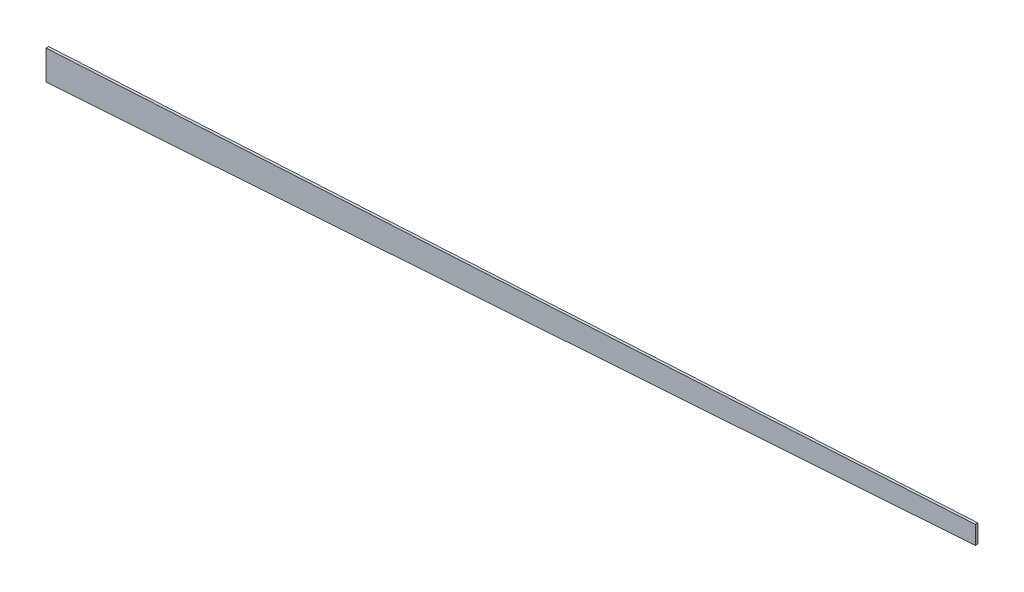
ISO-10303-21;
HEADER;
FILE_DESCRIPTION(('STEP AP214'),'2;1');
FILE_NAME('part.step','',(''),(''),'','','');
FILE_SCHEMA(('AUTOMOTIVE_DESIGN { 1 0 10303 214 1 1 1 1 }'));
ENDSEC;
DATA;
#1=APPLICATION_CONTEXT('core data for automotive mechanical design processes');
#2=APPLICATION_PROTOCOL_DEFINITION('international standard','automotive_design',2000,#1);
#3=PRODUCT_CONTEXT('',#1,'mechanical');
#4=PRODUCT('Part','Part','',(#3));
#5=PRODUCT_RELATED_PRODUCT_CATEGORY('part','',(#4));
#6=PRODUCT_DEFINITION_FORMATION('','',#4);
#7=PRODUCT_DEFINITION_CONTEXT('part definition',#1,'design');
#8=PRODUCT_DEFINITION('design','',#6,#7);
#9=PRODUCT_DEFINITION_SHAPE('','',#8);
#10=(LENGTH_UNIT() NAMED_UNIT(*) SI_UNIT(.MILLI.,.METRE.));
#11=(NAMED_UNIT(*) PLANE_ANGLE_UNIT() SI_UNIT($,.RADIAN.));
#12=(NAMED_UNIT(*) SI_UNIT($,.STERADIAN.) SOLID_ANGLE_UNIT());
#13=UNCERTAINTY_MEASURE_WITH_UNIT(LENGTH_MEASURE(1.E-05),#10,'distance_accuracy_value','');
#14=(GEOMETRIC_REPRESENTATION_CONTEXT(3) GLOBAL_UNCERTAINTY_ASSIGNED_CONTEXT((#13)) GLOBAL_UNIT_ASSIGNED_CONTEXT((#10,
#11,#12)) REPRESENTATION_CONTEXT('',''));
#15=CARTESIAN_POINT('',(0.,0.,0.));
#16=DIRECTION('',(0.,0.,1.));
#17=DIRECTION('',(1.,0.,0.));
#18=AXIS2_PLACEMENT_3D('',#15,#16,#17);
#19=CARTESIAN_POINT('',(-1000.,0.,0.));
#20=DIRECTION('',(1.,0.,0.));
#21=DIRECTION('',(0.,0.,-1.));
#22=AXIS2_PLACEMENT_3D('',#19,#20,#21);
#23=PLANE('',#22);
#24=DIRECTION('',(0.,-1.,0.));
#25=VECTOR('',#24,1.);
#26=CARTESIAN_POINT('',(-1000.,0.,179.5));
#27=LINE('',#26,#25);
#28=CARTESIAN_POINT('',(-1000.,26.,179.5));
#29=VERTEX_POINT('',#28);
#30=CARTESIAN_POINT('',(-1000.,0.,179.5));
#31=VERTEX_POINT('',#30);
#32=EDGE_CURVE('E270',#29,#31,#27,.T.);
#33=ORIENTED_EDGE('',*,*,#32,.F.);
#34=DIRECTION('',(0.,0.,1.));
#35=VECTOR('',#34,1.);
#36=CARTESIAN_POINT('',(-1000.,26.,176.5));
#37=LINE('',#36,#35);
#38=CARTESIAN_POINT('',(-1000.,26.,176.5));
#39=VERTEX_POINT('',#38);
#40=EDGE_CURVE('E262',#39,#29,#37,.T.);
#41=ORIENTED_EDGE('',*,*,#40,.F.);
#42=DIRECTION('',(0.,1.,0.));
#43=VECTOR('',#42,1.);
#44=CARTESIAN_POINT('',(-1000.,-8.,176.5));
#45=LINE('',#44,#43);
#46=CARTESIAN_POINT('',(-1000.,-8.,176.5));
#47=VERTEX_POINT('',#46);
#48=EDGE_CURVE('E256',#47,#39,#45,.T.);
#49=ORIENTED_EDGE('',*,*,#48,.F.);
#50=DIRECTION('',(0.,0.,-1.));
#51=VECTOR('',#50,1.);
#52=CARTESIAN_POINT('',(-1000.,-8.,179.5));
#53=LINE('',#52,#51);
#54=CARTESIAN_POINT('',(-1000.,-8.,179.5));
#55=VERTEX_POINT('',#54);
#56=EDGE_CURVE('E96',#55,#47,#53,.T.);
#57=ORIENTED_EDGE('',*,*,#56,.F.);
#58=DIRECTION('',(0.,-1.,0.));
#59=VECTOR('',#58,1.);
#60=CARTESIAN_POINT('',(-1000.,0.,179.5));
#61=LINE('',#60,#59);
#62=EDGE_CURVE('E12',#31,#55,#61,.T.);
#63=ORIENTED_EDGE('',*,*,#62,.F.);
#64=EDGE_LOOP('',(#33,#41,#49,#57,#63));
#65=FACE_BOUND('',#64,.T.);
#66=ADVANCED_FACE('F86',(#65),#23,.F.);
#67=CARTESIAN_POINT('',(0.,0.,0.));
#68=DIRECTION('',(-1.,0.,0.));
#69=DIRECTION('',(0.,0.,1.));
#70=AXIS2_PLACEMENT_3D('',#67,#68,#69);
#71=PLANE('',#70);
#72=DIRECTION('',(0.,1.,0.));
#73=VECTOR('',#72,1.);
#74=CARTESIAN_POINT('',(0.,16.,106.5));
#75=LINE('',#74,#73);
#76=CARTESIAN_POINT('',(0.,-5.,106.5));
#77=VERTEX_POINT('',#76);
#78=CARTESIAN_POINT('',(0.,16.,106.5));
#79=VERTEX_POINT('',#78);
#80=EDGE_CURVE('E137',#77,#79,#75,.T.);
#81=ORIENTED_EDGE('',*,*,#80,.T.);
#82=DIRECTION('',(0.,0.,1.));
#83=VECTOR('',#82,1.);
#84=CARTESIAN_POINT('',(0.,16.,109.5));
#85=LINE('',#84,#83);
#86=CARTESIAN_POINT('',(0.,16.,109.5));
#87=VERTEX_POINT('',#86);
#88=EDGE_CURVE('E164',#79,#87,#85,.T.);
#89=ORIENTED_EDGE('',*,*,#88,.T.);
#90=DIRECTION('',(0.,-1.,0.));
#91=VECTOR('',#90,1.);
#92=CARTESIAN_POINT('',(0.,-5.,109.5));
#93=LINE('',#92,#91);
#94=CARTESIAN_POINT('',(0.,-5.,109.5));
#95=VERTEX_POINT('',#94);
#96=EDGE_CURVE('E140',#87,#95,#93,.T.);
#97=ORIENTED_EDGE('',*,*,#96,.T.);
#98=DIRECTION('',(0.,0.,-1.));
#99=VECTOR('',#98,1.);
#100=CARTESIAN_POINT('',(0.,-5.,106.5));
#101=LINE('',#100,#99);
#102=EDGE_CURVE('E133',#95,#77,#101,.T.);
#103=ORIENTED_EDGE('',*,*,#102,.T.);
#104=EDGE_LOOP('',(#81,#89,#97,#103));
#105=FACE_BOUND('',#104,.T.);
#106=ADVANCED_FACE('F136',(#105),#71,.F.);
#107=CARTESIAN_POINT('',(0.,16.,106.5));
#108=DIRECTION('',(-0.0698291276999141,0.,-0.997558967141627));
#109=DIRECTION('',(0.,-1.,0.));
#110=AXIS2_PLACEMENT_3D('',#107,#108,#109);
#111=PLANE('',#110);
#112=ORIENTED_EDGE('',*,*,#80,.F.);
#113=DIRECTION('',(-0.9975545000452,-0.00299266350013561,0.0698288150031643));
#114=VECTOR('',#113,1.);
#115=CARTESIAN_POINT('',(-500.,-6.5,141.5));
#116=LINE('',#115,#114);
#117=EDGE_CURVE('E151',#77,#47,#116,.T.);
#118=ORIENTED_EDGE('',*,*,#117,.T.);
#119=ORIENTED_EDGE('',*,*,#48,.T.);
#120=DIRECTION('',(0.997509336107633,-0.00997509336107633,-0.0698256535275346));
#121=VECTOR('',#120,1.);
#122=CARTESIAN_POINT('',(-500.,21.,141.5));
#123=LINE('',#122,#121);
#124=EDGE_CURVE('E154',#39,#79,#123,.T.);
#125=ORIENTED_EDGE('',*,*,#124,.T.);
#126=EDGE_LOOP('',(#112,#118,#119,#125));
#127=FACE_BOUND('',#126,.T.);
#128=ADVANCED_FACE('F150',(#127),#111,.T.);
#129=CARTESIAN_POINT('',(0.,-5.,106.5));
#130=DIRECTION('',(0.00299998650009112,-0.999995500030375,0.));
#131=DIRECTION('',(0.,0.,1.));
#132=AXIS2_PLACEMENT_3D('',#129,#130,#131);
#133=PLANE('',#132);
#134=ORIENTED_EDGE('',*,*,#102,.F.);
#135=DIRECTION('',(-0.9975545000452,-0.0029926635001356,0.0698288150031643));
#136=VECTOR('',#135,1.);
#137=CARTESIAN_POINT('',(-500.,-6.5,144.5));
#138=LINE('',#137,#136);
#139=EDGE_CURVE('E104',#95,#55,#138,.T.);
#140=ORIENTED_EDGE('',*,*,#139,.T.);
#141=ORIENTED_EDGE('',*,*,#56,.T.);
#142=ORIENTED_EDGE('',*,*,#117,.F.);
#143=EDGE_LOOP('',(#134,#140,#141,#142));
#144=FACE_BOUND('',#143,.T.);
#145=ADVANCED_FACE('F159',(#144),#133,.T.);
#146=CARTESIAN_POINT('',(0.,16.,109.5));
#147=DIRECTION('',(0.00999950003749688,0.999950003749688,0.));
#148=DIRECTION('',(0.,0.,-1.));
#149=AXIS2_PLACEMENT_3D('',#146,#147,#148);
#150=PLANE('',#149);
#151=ORIENTED_EDGE('',*,*,#88,.F.);
#152=ORIENTED_EDGE('',*,*,#124,.F.);
#153=ORIENTED_EDGE('',*,*,#40,.T.);
#154=DIRECTION('',(-0.997509336107633,0.00997509336107633,0.0698256535275346));
#155=VECTOR('',#154,1.);
#156=CARTESIAN_POINT('',(-500.,21.,144.5));
#157=LINE('',#156,#155);
#158=EDGE_CURVE('E162',#87,#29,#157,.T.);
#159=ORIENTED_EDGE('',*,*,#158,.F.);
#160=EDGE_LOOP('',(#151,#152,#153,#159));
#161=FACE_BOUND('',#160,.T.);
#162=ADVANCED_FACE('F184',(#161),#150,.T.);
#163=CARTESIAN_POINT('',(0.,-5.,109.5));
#164=DIRECTION('',(0.0698291276999141,0.,0.997558967141627));
#165=DIRECTION('',(0.,1.,0.));
#166=AXIS2_PLACEMENT_3D('',#163,#164,#165);
#167=PLANE('',#166);
#168=ORIENTED_EDGE('',*,*,#96,.F.);
#169=ORIENTED_EDGE('',*,*,#158,.T.);
#170=ORIENTED_EDGE('',*,*,#32,.T.);
#171=ORIENTED_EDGE('',*,*,#62,.T.);
#172=ORIENTED_EDGE('',*,*,#139,.F.);
#173=EDGE_LOOP('',(#168,#169,#170,#171,#172));
#174=FACE_BOUND('',#173,.T.);
#175=ADVANCED_FACE('F300',(#174),#167,.T.);
#176=CLOSED_SHELL('',(#66,#106,#128,#145,#162,#175));
#177=MANIFOLD_SOLID_BREP('B2',#176);
#178=ADVANCED_BREP_SHAPE_REPRESENTATION('',(#18,#177),#14);
#179=SHAPE_DEFINITION_REPRESENTATION(#9,#178);
ENDSEC;
END-ISO-10303-21;
